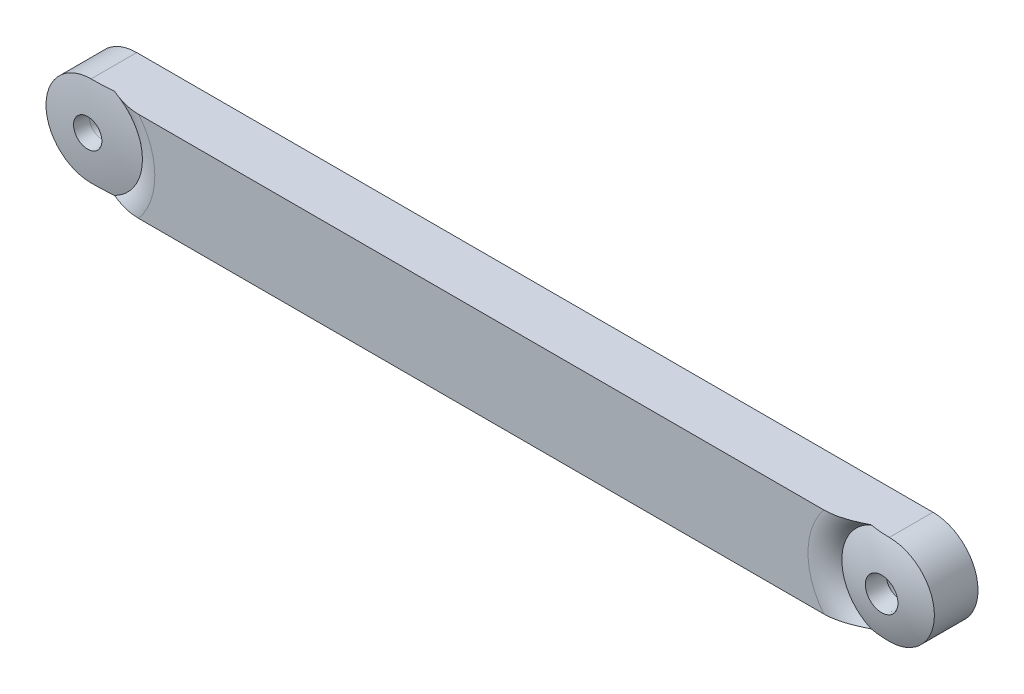
ISO-10303-21;
HEADER;
FILE_DESCRIPTION(('STEP AP214'),'2;1');
FILE_NAME('part.step','',(''),(''),'','','');
FILE_SCHEMA(('AUTOMOTIVE_DESIGN { 1 0 10303 214 1 1 1 1 }'));
ENDSEC;
DATA;
#1=APPLICATION_CONTEXT('core data for automotive mechanical design processes');
#2=APPLICATION_PROTOCOL_DEFINITION('international standard','automotive_design',2000,#1);
#3=PRODUCT_CONTEXT('',#1,'mechanical');
#4=PRODUCT('Part','Part','',(#3));
#5=PRODUCT_RELATED_PRODUCT_CATEGORY('part','',(#4));
#6=PRODUCT_DEFINITION_FORMATION('','',#4);
#7=PRODUCT_DEFINITION_CONTEXT('part definition',#1,'design');
#8=PRODUCT_DEFINITION('design','',#6,#7);
#9=PRODUCT_DEFINITION_SHAPE('','',#8);
#10=(LENGTH_UNIT() NAMED_UNIT(*) SI_UNIT(.MILLI.,.METRE.));
#11=(NAMED_UNIT(*) PLANE_ANGLE_UNIT() SI_UNIT($,.RADIAN.));
#12=(NAMED_UNIT(*) SI_UNIT($,.STERADIAN.) SOLID_ANGLE_UNIT());
#13=UNCERTAINTY_MEASURE_WITH_UNIT(LENGTH_MEASURE(1.E-05),#10,'distance_accuracy_value','');
#14=(GEOMETRIC_REPRESENTATION_CONTEXT(3) GLOBAL_UNCERTAINTY_ASSIGNED_CONTEXT((#13)) GLOBAL_UNIT_ASSIGNED_CONTEXT((#10,
#11,#12)) REPRESENTATION_CONTEXT('',''));
#15=CARTESIAN_POINT('',(0.,0.,0.));
#16=DIRECTION('',(0.,0.,1.));
#17=DIRECTION('',(1.,0.,0.));
#18=AXIS2_PLACEMENT_3D('',#15,#16,#17);
#19=CARTESIAN_POINT('',(18.5,89.493831222226,7.));
#20=DIRECTION('',(0.,1.,0.));
#21=DIRECTION('',(0.,0.,1.));
#22=AXIS2_PLACEMENT_3D('',#19,#20,#21);
#23=PLANE('',#22);
#24=CARTESIAN_POINT('',(124.5,89.493831222226,-8.97302143660501));
#25=DIRECTION('',(0.,1.,0.));
#26=DIRECTION('',(0.,0.,1.));
#27=AXIS2_PLACEMENT_3D('',#24,#25,#26);
#28=CIRCLE('',#27,14.7790451878915);
#29=CARTESIAN_POINT('',(124.5,89.493831222226,5.80602375128649));
#30=VERTEX_POINT('',#29);
#31=CARTESIAN_POINT('',(121.841743549819,89.493831222226,5.56499250309148));
#32=VERTEX_POINT('',#31);
#33=EDGE_CURVE('E119',#30,#32,#28,.F.);
#34=ORIENTED_EDGE('',*,*,#33,.T.);
#35=CARTESIAN_POINT('',(121.841743549819,89.493831222226,5.56499250309148));
#36=CARTESIAN_POINT('',(121.765317920901,89.493831222226,5.60204342012413));
#37=CARTESIAN_POINT('',(121.688876041818,89.493831222226,5.63906136675053));
#38=CARTESIAN_POINT('',(121.535841858416,89.493831222226,5.7127945517908));
#39=CARTESIAN_POINT('',(121.459249546677,89.493831222226,5.74950977478596));
#40=CARTESIAN_POINT('',(121.228991767959,89.493831222226,5.85888322927997));
#41=CARTESIAN_POINT('',(121.074934736782,89.493831222226,5.93072527463705));
#42=CARTESIAN_POINT('',(120.763998675751,89.493831222226,6.07116072767521));
#43=CARTESIAN_POINT('',(120.607107322743,89.493831222226,6.13972708391815));
#44=CARTESIAN_POINT('',(120.291178799112,89.493831222226,6.27165703233452));
#45=CARTESIAN_POINT('',(120.132142097978,89.493831222226,6.33502174200288));
#46=CARTESIAN_POINT('',(119.816106700858,89.493831222226,6.4536111009045));
#47=CARTESIAN_POINT('',(119.659175685572,89.493831222226,6.50901403404406));
#48=CARTESIAN_POINT('',(119.342952300375,89.493831222226,6.61260636058026));
#49=CARTESIAN_POINT('',(119.183659586522,89.493831222226,6.66079469172305));
#50=CARTESIAN_POINT('',(118.703242771847,89.493831222226,6.79261191880632));
#51=CARTESIAN_POINT('',(118.378468328636,89.493831222226,6.86392589629964));
#52=CARTESIAN_POINT('',(117.961259568196,89.493831222226,6.92816639643227));
#53=CARTESIAN_POINT('',(117.871605331821,89.493831222226,6.94038501670056));
#54=CARTESIAN_POINT('',(117.691885483508,89.493831222226,6.96156572368667));
#55=CARTESIAN_POINT('',(117.60181979638,89.493831222226,6.97052718892575));
#56=CARTESIAN_POINT('',(117.420748036511,89.493831222226,6.98507127344322));
#57=CARTESIAN_POINT('',(117.329739921034,89.493831222226,6.99062854189178));
#58=CARTESIAN_POINT('',(117.147581440085,89.493831222226,6.99809306103417));
#59=CARTESIAN_POINT('',(117.056431084771,89.493831222226,7.00000056141239));
#60=CARTESIAN_POINT('',(116.965272567196,89.493831222226,7.));
#61=B_SPLINE_CURVE_WITH_KNOTS('',3,(#35,#36,#37,#38,#39,#40,#41,#42,#43,#44,#45,#46,#47,#48,#49,
#50,#51,#52,#53,#54,#55,#56,#57,#58,#59,#60),.UNSPECIFIED.,.F.,.F.,(4,2,2,2,2,2,2,2,2,2,2,2,4),
(0.,0.254799675225444,0.509612249056838,1.0195359417198,1.53312357744277,2.04660058630545,
2.54569574884536,3.04486432437009,4.03963558253979,4.31104793084022,4.58251203859394,
4.85597389674887,5.12941704642665),.UNSPECIFIED.);
#62=CARTESIAN_POINT('',(116.965272567196,89.493831222226,7.));
#63=VERTEX_POINT('',#62);
#64=EDGE_CURVE('E122',#32,#63,#61,.T.);
#65=ORIENTED_EDGE('',*,*,#64,.T.);
#66=DIRECTION('',(1.,0.,0.));
#67=VECTOR('',#66,1.);
#68=CARTESIAN_POINT('',(18.5,89.493831222226,7.));
#69=LINE('',#68,#67);
#70=CARTESIAN_POINT('',(25.747500542297,89.493831222226,7.));
#71=VERTEX_POINT('',#70);
#72=EDGE_CURVE('E151',#71,#63,#69,.T.);
#73=ORIENTED_EDGE('',*,*,#72,.F.);
#74=CARTESIAN_POINT('',(25.747500542297,89.493831222226,7.));
#75=CARTESIAN_POINT('',(25.5169920155151,89.493831222226,7.00002588931948));
#76=CARTESIAN_POINT('',(25.2867684330342,89.493831222226,6.98818973963392));
#77=CARTESIAN_POINT('',(24.8288789761796,89.493831222226,6.94382752944468));
#78=CARTESIAN_POINT('',(24.6012080426734,89.493831222226,6.91135481729332));
#79=CARTESIAN_POINT('',(24.1515943162239,89.493831222226,6.82915886363204));
#80=CARTESIAN_POINT('',(23.929616433177,89.493831222226,6.77962120165669));
#81=CARTESIAN_POINT('',(23.4892788959588,89.493831222226,6.6661816275087));
#82=CARTESIAN_POINT('',(23.2709213362471,89.493831222226,6.60227169192598));
#83=CARTESIAN_POINT('',(22.9237555503254,89.493831222226,6.49080749413817));
#84=CARTESIAN_POINT('',(22.793775785392,89.493831222226,6.44681821387364));
#85=CARTESIAN_POINT('',(22.5350330104064,89.493831222226,6.35549810704841));
#86=CARTESIAN_POINT('',(22.4062696987997,89.493831222226,6.30816813466476));
#87=CARTESIAN_POINT('',(22.1488702397114,89.493831222226,6.21060945555799));
#88=CARTESIAN_POINT('',(22.0202407031539,89.493831222226,6.16036347797218));
#89=CARTESIAN_POINT('',(21.7636500830924,89.493831222226,6.05818092342479));
#90=CARTESIAN_POINT('',(21.635689010849,89.493831222226,6.00624431808986));
#91=CARTESIAN_POINT('',(21.5078993854901,89.493831222226,5.95392201712425));
#92=B_SPLINE_CURVE_WITH_KNOTS('',3,(#74,#75,#76,#77,#78,#79,#80,#81,#82,#83,#84,#85,#86,#87,#88,
#89,#90,#91),.UNSPECIFIED.,.F.,.F.,(4,2,2,2,2,2,2,2,4),(0.,0.69081013705975,1.37984165937013,
2.06160496880793,2.7437498257981,3.15537294830445,3.56689120207225,3.98116190171699,
4.39543955754246),.UNSPECIFIED.);
#93=CARTESIAN_POINT('',(21.5078993854901,89.493831222226,5.95392201712427));
#94=VERTEX_POINT('',#93);
#95=EDGE_CURVE('E183',#71,#94,#92,.T.);
#96=ORIENTED_EDGE('',*,*,#95,.T.);
#97=CARTESIAN_POINT('',(18.5,89.493831222226,-30.0113724473254));
#98=DIRECTION('',(0.,1.,0.));
#99=DIRECTION('',(0.,0.,1.));
#100=AXIS2_PLACEMENT_3D('',#97,#98,#99);
#101=CIRCLE('',#100,36.0908556926516);
#102=CARTESIAN_POINT('',(18.5,89.493831222226,6.07948324532625));
#103=VERTEX_POINT('',#102);
#104=EDGE_CURVE('E146',#103,#94,#101,.T.);
#105=ORIENTED_EDGE('',*,*,#104,.F.);
#106=DIRECTION('',(0.,0.,-1.));
#107=VECTOR('',#106,1.);
#108=CARTESIAN_POINT('',(18.5,89.493831222226,7.));
#109=LINE('',#108,#107);
#110=CARTESIAN_POINT('',(18.5,89.493831222226,0.));
#111=VERTEX_POINT('',#110);
#112=EDGE_CURVE('E172',#103,#111,#109,.T.);
#113=ORIENTED_EDGE('',*,*,#112,.T.);
#114=DIRECTION('',(1.,0.,0.));
#115=VECTOR('',#114,1.);
#116=CARTESIAN_POINT('',(18.5,89.493831222226,0.));
#117=LINE('',#116,#115);
#118=CARTESIAN_POINT('',(124.5,89.493831222226,0.));
#119=VERTEX_POINT('',#118);
#120=EDGE_CURVE('E159',#111,#119,#117,.T.);
#121=ORIENTED_EDGE('',*,*,#120,.T.);
#122=DIRECTION('',(0.,0.,-1.));
#123=VECTOR('',#122,1.);
#124=CARTESIAN_POINT('',(124.5,89.493831222226,7.));
#125=LINE('',#124,#123);
#126=EDGE_CURVE('E170',#30,#119,#125,.T.);
#127=ORIENTED_EDGE('',*,*,#126,.F.);
#128=EDGE_LOOP('',(#34,#65,#73,#96,#105,#113,#121,#127));
#129=FACE_BOUND('',#128,.T.);
#130=ADVANCED_FACE('F35',(#129),#23,.F.);
#131=CARTESIAN_POINT('',(18.5,101.493831222226,7.));
#132=DIRECTION('',(0.,-1.,0.));
#133=DIRECTION('',(1.,0.,0.));
#134=AXIS2_PLACEMENT_3D('',#131,#132,#133);
#135=PLANE('',#134);
#136=DIRECTION('',(-1.,0.,0.));
#137=VECTOR('',#136,1.);
#138=CARTESIAN_POINT('',(18.5,101.493831222226,7.));
#139=LINE('',#138,#137);
#140=CARTESIAN_POINT('',(116.965272567196,101.493831222226,7.));
#141=VERTEX_POINT('',#140);
#142=CARTESIAN_POINT('',(25.747500542297,101.493831222226,7.));
#143=VERTEX_POINT('',#142);
#144=EDGE_CURVE('E109',#141,#143,#139,.T.);
#145=ORIENTED_EDGE('',*,*,#144,.F.);
#146=CARTESIAN_POINT('',(116.965272567196,101.493831222226,7.));
#147=CARTESIAN_POINT('',(117.184672998858,101.493831222226,7.00001787596287));
#148=CARTESIAN_POINT('',(117.403844912924,101.493831222226,6.98896244737383));
#149=CARTESIAN_POINT('',(117.839875358581,101.493831222226,6.94716197226956));
#150=CARTESIAN_POINT('',(118.056737765339,101.493831222226,6.91645809091732));
#151=CARTESIAN_POINT('',(118.484402536377,101.493831222226,6.83831254298038));
#152=CARTESIAN_POINT('',(118.695247069074,101.493831222226,6.79109530042298));
#153=CARTESIAN_POINT('',(119.113181162417,101.493831222226,6.68220642957654));
#154=CARTESIAN_POINT('',(119.320269798328,101.493831222226,6.62053129230834));
#155=CARTESIAN_POINT('',(119.723481231176,101.493831222226,6.48740957795611));
#156=CARTESIAN_POINT('',(119.919738083752,101.493831222226,6.41636375120915));
#157=CARTESIAN_POINT('',(120.308730469959,101.493831222226,6.26520762910714));
#158=CARTESIAN_POINT('',(120.501465468203,101.493831222226,6.18509596867409));
#159=CARTESIAN_POINT('',(120.789642635796,101.493831222226,6.05936424705059));
#160=CARTESIAN_POINT('',(120.886182926368,101.493831222226,6.01622201449506));
#161=CARTESIAN_POINT('',(121.07864142418,101.493831222226,5.92856676950205));
#162=CARTESIAN_POINT('',(121.174559623077,101.493831222226,5.88405373872769));
#163=CARTESIAN_POINT('',(121.365832451622,101.493831222226,5.79407005305124));
#164=CARTESIAN_POINT('',(121.461187527706,101.493831222226,5.74860034154747));
#165=CARTESIAN_POINT('',(121.651620380279,101.493831222226,5.65710491264787));
#166=CARTESIAN_POINT('',(121.746698181258,101.493831222226,5.6110792463244));
#167=CARTESIAN_POINT('',(121.841743549819,101.493831222226,5.56499250309151));
#168=B_SPLINE_CURVE_WITH_KNOTS('',3,(#146,#147,#148,#149,#150,#151,#152,#153,#154,#155,#156,
#157,#158,#159,#160,#161,#162,#163,#164,#165,#166,#167),.UNSPECIFIED.,.F.,.F.,(4,2,2,2,2,2,2,2,
2,2,4),(0.,0.657592536034672,1.31381185085826,1.96143880953814,2.60922311246948,
3.23511158444727,3.86109442460975,4.17831125031737,4.49553232121324,4.81245401643313,
5.12934681602724),.UNSPECIFIED.);
#169=CARTESIAN_POINT('',(121.841743549819,101.493831222226,5.56499250309148));
#170=VERTEX_POINT('',#169);
#171=EDGE_CURVE('E11',#141,#170,#168,.T.);
#172=ORIENTED_EDGE('',*,*,#171,.T.);
#173=CARTESIAN_POINT('',(124.5,101.493831222226,-8.97302143660501));
#174=DIRECTION('',(0.,-1.,0.));
#175=DIRECTION('',(1.,0.,0.));
#176=AXIS2_PLACEMENT_3D('',#173,#174,#175);
#177=CIRCLE('',#176,14.7790451878915);
#178=CARTESIAN_POINT('',(124.5,101.493831222226,5.80602375128649));
#179=VERTEX_POINT('',#178);
#180=EDGE_CURVE('E107',#170,#179,#177,.F.);
#181=ORIENTED_EDGE('',*,*,#180,.T.);
#182=DIRECTION('',(0.,0.,-1.));
#183=VECTOR('',#182,1.);
#184=CARTESIAN_POINT('',(124.5,101.493831222226,7.));
#185=LINE('',#184,#183);
#186=CARTESIAN_POINT('',(124.5,101.493831222226,0.));
#187=VERTEX_POINT('',#186);
#188=EDGE_CURVE('E168',#179,#187,#185,.T.);
#189=ORIENTED_EDGE('',*,*,#188,.T.);
#190=DIRECTION('',(-1.,0.,0.));
#191=VECTOR('',#190,1.);
#192=CARTESIAN_POINT('',(18.5,101.493831222226,0.));
#193=LINE('',#192,#191);
#194=CARTESIAN_POINT('',(18.5,101.493831222226,0.));
#195=VERTEX_POINT('',#194);
#196=EDGE_CURVE('E153',#187,#195,#193,.T.);
#197=ORIENTED_EDGE('',*,*,#196,.T.);
#198=DIRECTION('',(0.,0.,-1.));
#199=VECTOR('',#198,1.);
#200=CARTESIAN_POINT('',(18.5,101.493831222226,7.));
#201=LINE('',#200,#199);
#202=CARTESIAN_POINT('',(18.5,101.493831222226,6.07948324532625));
#203=VERTEX_POINT('',#202);
#204=EDGE_CURVE('E155',#203,#195,#201,.T.);
#205=ORIENTED_EDGE('',*,*,#204,.F.);
#206=CARTESIAN_POINT('',(18.5,101.493831222226,-30.0113724473254));
#207=DIRECTION('',(0.,-1.,0.));
#208=DIRECTION('',(1.,0.,0.));
#209=AXIS2_PLACEMENT_3D('',#206,#207,#208);
#210=CIRCLE('',#209,36.0908556926516);
#211=CARTESIAN_POINT('',(21.5078993854902,101.493831222226,5.95392201712427));
#212=VERTEX_POINT('',#211);
#213=EDGE_CURVE('E174',#212,#203,#210,.T.);
#214=ORIENTED_EDGE('',*,*,#213,.F.);
#215=CARTESIAN_POINT('',(21.5078993854902,101.493831222226,5.95392201712427));
#216=CARTESIAN_POINT('',(21.5926536728955,101.493831222226,5.98860839873557));
#217=CARTESIAN_POINT('',(21.6774730391797,101.493831222226,6.02313741677694));
#218=CARTESIAN_POINT('',(21.8473595161257,101.493831222226,6.09159688736667));
#219=CARTESIAN_POINT('',(21.9324266437582,101.493831222226,6.12552729773314));
#220=CARTESIAN_POINT('',(22.1882767086164,101.493831222226,6.22603404367458));
#221=CARTESIAN_POINT('',(22.3595908262225,101.493831222226,6.29127688167225));
#222=CARTESIAN_POINT('',(22.7025238441883,101.493831222226,6.41560894361206));
#223=CARTESIAN_POINT('',(22.8741226209567,101.493831222226,6.47475310702858));
#224=CARTESIAN_POINT('',(23.2196117271588,101.493831222226,6.58591140083442));
#225=CARTESIAN_POINT('',(23.393501745622,101.493831222226,6.63792648808529));
#226=CARTESIAN_POINT('',(23.7452251123599,101.493831222226,6.73366009728708));
#227=CARTESIAN_POINT('',(23.9230797082013,101.493831222226,6.77730145263285));
#228=CARTESIAN_POINT('',(24.2810258359925,101.493831222226,6.85413347819978));
#229=CARTESIAN_POINT('',(24.46111699277,101.493831222226,6.88732587721382));
#230=CARTESIAN_POINT('',(24.824899065325,101.493831222226,6.94199792849482));
#231=CARTESIAN_POINT('',(25.0086079523525,101.493831222226,6.96336102994884));
#232=CARTESIAN_POINT('',(25.3773368336589,101.493831222226,6.99237728423305));
#233=CARTESIAN_POINT('',(25.5623582631819,101.493831222226,7.00001188870514));
#234=CARTESIAN_POINT('',(25.747500542297,101.493831222226,7.));
#235=B_SPLINE_CURVE_WITH_KNOTS('',3,(#215,#216,#217,#218,#219,#220,#221,#222,#223,#224,#225,
#226,#227,#228,#229,#230,#231,#232,#233,#234),.UNSPECIFIED.,.F.,.F.,(4,2,2,2,2,2,2,2,2,4),(0.,
0.274732558079257,0.549484398940114,1.09936997138419,1.6437648951629,2.18808667878282,
2.73720610299631,3.28623462690635,3.84058046715998,4.39567471428942),.UNSPECIFIED.);
#236=EDGE_CURVE('E49',#212,#143,#235,.T.);
#237=ORIENTED_EDGE('',*,*,#236,.T.);
#238=EDGE_LOOP('',(#145,#172,#181,#189,#197,#205,#214,#237));
#239=FACE_BOUND('',#238,.T.);
#240=ADVANCED_FACE('F106',(#239),#135,.F.);
#241=CARTESIAN_POINT('',(18.5,95.493831222226,7.));
#242=DIRECTION('',(0.,0.,-1.));
#243=DIRECTION('',(-1.,0.,0.));
#244=AXIS2_PLACEMENT_3D('',#241,#242,#243);
#245=CYLINDRICAL_SURFACE('',#244,5.99999999999999);
#246=CARTESIAN_POINT('',(18.5,95.493831222226,6.07948324532625));
#247=DIRECTION('',(0.,0.,-1.));
#248=DIRECTION('',(-1.,0.,0.));
#249=AXIS2_PLACEMENT_3D('',#246,#247,#248);
#250=CIRCLE('',#249,5.99999999999999);
#251=EDGE_CURVE('E144',#203,#103,#250,.F.);
#252=ORIENTED_EDGE('',*,*,#251,.F.);
#253=ORIENTED_EDGE('',*,*,#204,.T.);
#254=CARTESIAN_POINT('',(18.5,95.493831222226,0.));
#255=DIRECTION('',(0.,0.,1.));
#256=DIRECTION('',(1.,0.,0.));
#257=AXIS2_PLACEMENT_3D('',#254,#255,#256);
#258=CIRCLE('',#257,5.99999999999999);
#259=EDGE_CURVE('E156',#195,#111,#258,.T.);
#260=ORIENTED_EDGE('',*,*,#259,.T.);
#261=ORIENTED_EDGE('',*,*,#112,.F.);
#262=EDGE_LOOP('',(#252,#253,#260,#261));
#263=FACE_BOUND('',#262,.T.);
#264=ADVANCED_FACE('F203',(#263),#245,.T.);
#265=CARTESIAN_POINT('',(18.5,95.493831222226,7.));
#266=DIRECTION('',(0.,0.,1.));
#267=DIRECTION('',(1.,0.,0.));
#268=AXIS2_PLACEMENT_3D('',#265,#266,#267);
#269=PLANE('',#268);
#270=ORIENTED_EDGE('',*,*,#72,.T.);
#271=CARTESIAN_POINT('',(124.5,95.493831222226,7.));
#272=DIRECTION('',(0.,0.,1.));
#273=DIRECTION('',(1.,0.,0.));
#274=AXIS2_PLACEMENT_3D('',#271,#272,#273);
#275=CIRCLE('',#274,9.63182835637385);
#276=EDGE_CURVE('E62',#63,#141,#275,.F.);
#277=ORIENTED_EDGE('',*,*,#276,.T.);
#278=ORIENTED_EDGE('',*,*,#144,.T.);
#279=CARTESIAN_POINT('',(18.5,95.493831222226,7.));
#280=DIRECTION('',(0.,0.,1.));
#281=DIRECTION('',(1.,0.,0.));
#282=AXIS2_PLACEMENT_3D('',#279,#280,#281);
#283=CIRCLE('',#282,9.40883967929071);
#284=EDGE_CURVE('E274',#143,#71,#283,.F.);
#285=ORIENTED_EDGE('',*,*,#284,.T.);
#286=EDGE_LOOP('',(#270,#277,#278,#285));
#287=FACE_BOUND('',#286,.T.);
#288=ADVANCED_FACE('F206',(#287),#269,.T.);
#289=CARTESIAN_POINT('',(18.5,95.493831222226,0.));
#290=DIRECTION('',(0.,0.,1.));
#291=DIRECTION('',(1.,0.,0.));
#292=AXIS2_PLACEMENT_3D('',#289,#290,#291);
#293=PLANE('',#292);
#294=CARTESIAN_POINT('',(124.5,95.493831222226,0.));
#295=DIRECTION('',(0.,0.,1.));
#296=DIRECTION('',(1.,0.,0.));
#297=AXIS2_PLACEMENT_3D('',#294,#295,#296);
#298=CIRCLE('',#297,3.96601629417615);
#299=CARTESIAN_POINT('',(128.466016294176,95.493831222226,0.));
#300=VERTEX_POINT('',#299);
#301=EDGE_CURVE('E131',#300,#300,#298,.T.);
#302=ORIENTED_EDGE('',*,*,#301,.T.);
#303=EDGE_LOOP('',(#302));
#304=FACE_BOUND('',#303,.T.);
#305=CARTESIAN_POINT('',(18.5,95.493831222226,0.));
#306=DIRECTION('',(0.,0.,1.));
#307=DIRECTION('',(1.,0.,0.));
#308=AXIS2_PLACEMENT_3D('',#305,#306,#307);
#309=CIRCLE('',#308,3.48242734780151);
#310=CARTESIAN_POINT('',(21.9824273478015,95.493831222226,0.));
#311=VERTEX_POINT('',#310);
#312=EDGE_CURVE('E150',#311,#311,#309,.F.);
#313=ORIENTED_EDGE('',*,*,#312,.F.);
#314=EDGE_LOOP('',(#313));
#315=FACE_BOUND('',#314,.T.);
#316=ORIENTED_EDGE('',*,*,#259,.F.);
#317=ORIENTED_EDGE('',*,*,#196,.F.);
#318=CARTESIAN_POINT('',(124.5,95.493831222226,0.));
#319=DIRECTION('',(0.,0.,1.));
#320=DIRECTION('',(1.,0.,0.));
#321=AXIS2_PLACEMENT_3D('',#318,#319,#320);
#322=CIRCLE('',#321,6.00000000000001);
#323=EDGE_CURVE('E162',#119,#187,#322,.T.);
#324=ORIENTED_EDGE('',*,*,#323,.F.);
#325=ORIENTED_EDGE('',*,*,#120,.F.);
#326=EDGE_LOOP('',(#316,#317,#324,#325));
#327=FACE_BOUND('',#326,.T.);
#328=ADVANCED_FACE('F263',(#304,#315,#327),#293,.F.);
#329=CARTESIAN_POINT('',(124.5,95.493831222226,7.));
#330=DIRECTION('',(0.,0.,-1.));
#331=DIRECTION('',(-1.,0.,0.));
#332=AXIS2_PLACEMENT_3D('',#329,#330,#331);
#333=CYLINDRICAL_SURFACE('',#332,6.00000000000001);
#334=ORIENTED_EDGE('',*,*,#188,.F.);
#335=CARTESIAN_POINT('',(124.5,95.493831222226,5.80602375128649));
#336=DIRECTION('',(0.,0.,-1.));
#337=DIRECTION('',(-1.,0.,0.));
#338=AXIS2_PLACEMENT_3D('',#335,#336,#337);
#339=CIRCLE('',#338,6.00000000000001);
#340=EDGE_CURVE('E118',#179,#30,#339,.T.);
#341=ORIENTED_EDGE('',*,*,#340,.T.);
#342=ORIENTED_EDGE('',*,*,#126,.T.);
#343=ORIENTED_EDGE('',*,*,#323,.T.);
#344=EDGE_LOOP('',(#334,#341,#342,#343));
#345=FACE_BOUND('',#344,.T.);
#346=ADVANCED_FACE('F202',(#345),#333,.T.);
#347=CARTESIAN_POINT('',(18.5,95.493831222226,-0.188328384760994));
#348=DIRECTION('',(0.,0.,-1.));
#349=DIRECTION('',(-1.,0.,0.));
#350=AXIS2_PLACEMENT_3D('',#347,#348,#349);
#351=CONICAL_SURFACE('',#350,3.5,0.0930391787987164);
#352=CARTESIAN_POINT('',(18.5,95.493831222226,0.893662385724943));
#353=DIRECTION('',(0.,0.,1.));
#354=DIRECTION('',(1.,0.,0.));
#355=AXIS2_PLACEMENT_3D('',#352,#353,#354);
#356=CIRCLE('',#355,3.39904098887773);
#357=CARTESIAN_POINT('',(15.1009590111223,95.493831222226,0.893662385724948));
#358=VERTEX_POINT('',#357);
#359=EDGE_CURVE('E140',#358,#358,#356,.T.);
#360=ORIENTED_EDGE('',*,*,#359,.T.);
#361=EDGE_LOOP('',(#360));
#362=FACE_BOUND('',#361,.T.);
#363=ORIENTED_EDGE('',*,*,#312,.T.);
#364=EDGE_LOOP('',(#363));
#365=FACE_BOUND('',#364,.T.);
#366=ADVANCED_FACE('F251',(#362,#365),#351,.F.);
#367=CARTESIAN_POINT('',(18.5,95.493831222226,37.3216239672317));
#368=DIRECTION('',(0.,0.,1.));
#369=DIRECTION('',(-1.,0.,0.));
#370=AXIS2_PLACEMENT_3D('',#367,#368,#369);
#371=SPHERICAL_SURFACE('',#370,36.5861977339516);
#372=CARTESIAN_POINT('',(18.5,95.493831222226,0.783957184651782));
#373=DIRECTION('',(0.,0.,1.));
#374=DIRECTION('',(1.,0.,0.));
#375=AXIS2_PLACEMENT_3D('',#372,#373,#374);
#376=CIRCLE('',#375,1.88381812098707);
#377=CARTESIAN_POINT('',(16.6161818790131,95.493831222226,0.783957184651775));
#378=VERTEX_POINT('',#377);
#379=EDGE_CURVE('E132',#378,#378,#376,.T.);
#380=CARTESIAN_POINT('',(16.6161818790131,95.493831222226,0.783957184651775));
#381=CARTESIAN_POINT('',(16.6003768482195,95.493831222226,0.784772064358287));
#382=CARTESIAN_POINT('',(16.5845723461631,95.493831222226,0.785597199206291));
#383=CARTESIAN_POINT('',(16.5529644261386,95.493831222226,0.787267977768484));
#384=CARTESIAN_POINT('',(16.5371610081704,95.493831222226,0.788113621482674));
#385=CARTESIAN_POINT('',(16.5055552829362,95.493831222226,0.789825416360444));
#386=CARTESIAN_POINT('',(16.4897529756702,95.493831222226,0.790691567524025));
#387=CARTESIAN_POINT('',(16.4581494984518,95.493831222226,0.792444375839986));
#388=CARTESIAN_POINT('',(16.4423483284995,95.493831222226,0.793331032992367));
#389=CARTESIAN_POINT('',(16.4107471525183,95.493831222226,0.795124851793297));
#390=CARTESIAN_POINT('',(16.3949471464895,95.493831222226,0.796032013441845));
#391=CARTESIAN_POINT('',(16.3633483249631,95.493831222226,0.797866839707272));
#392=CARTESIAN_POINT('',(16.3475495094655,95.493831222226,0.79879450432415));
#393=CARTESIAN_POINT('',(16.3159530956073,95.493831222226,0.800670334964053));
#394=CARTESIAN_POINT('',(16.3001554972468,95.493831222226,0.801618500987079));
#395=CARTESIAN_POINT('',(16.2685615442665,95.493831222226,0.803535332842521));
#396=CARTESIAN_POINT('',(16.2527651896468,95.493831222226,0.804503998674937));
#397=CARTESIAN_POINT('',(16.2211737507497,95.493831222226,0.806461828517897));
#398=CARTESIAN_POINT('',(16.2053786664723,95.493831222226,0.807450992528441));
#399=CARTESIAN_POINT('',(16.1737897948596,95.493831222226,0.809449817061862));
#400=CARTESIAN_POINT('',(16.1579960075241,95.493831222226,0.810459477584739));
#401=CARTESIAN_POINT('',(16.1264097563925,95.493831222226,0.812499293442525));
#402=CARTESIAN_POINT('',(16.1106172925963,95.493831222226,0.813529448777433));
#403=CARTESIAN_POINT('',(16.0790337151382,95.493831222226,0.81561025252446));
#404=CARTESIAN_POINT('',(16.0632426014764,95.493831222226,0.816660900936579));
#405=CARTESIAN_POINT('',(16.0316617508798,95.493831222226,0.818782689068702));
#406=CARTESIAN_POINT('',(16.015872013945,95.493831222226,0.819853828788706));
#407=CARTESIAN_POINT('',(15.9842939433932,95.493831222226,0.822016597732754));
#408=CARTESIAN_POINT('',(15.968505609776,95.493831222226,0.823108226956798));
#409=CARTESIAN_POINT('',(15.9369303724476,95.493831222226,0.825311973070583));
#410=CARTESIAN_POINT('',(15.9211434687362,95.493831222226,0.826424089960325));
#411=CARTESIAN_POINT('',(15.889571117805,95.493831222226,0.828668809532666));
#412=CARTESIAN_POINT('',(15.8737856705851,95.493831222226,0.829801412215265));
#413=CARTESIAN_POINT('',(15.8422162592201,95.493831222226,0.832087101465972));
#414=CARTESIAN_POINT('',(15.826432295075,95.493831222226,0.833240188034079));
#415=CARTESIAN_POINT('',(15.7948658764403,95.493831222226,0.835566843113958));
#416=CARTESIAN_POINT('',(15.7790834219507,95.493831222226,0.83674041162573));
#417=CARTESIAN_POINT('',(15.7475200492052,95.493831222226,0.83910802861662));
#418=CARTESIAN_POINT('',(15.7317391309494,95.493831222226,0.840302077095737));
#419=CARTESIAN_POINT('',(15.7001788572471,95.493831222226,0.84271065201048));
#420=CARTESIAN_POINT('',(15.6843995018006,95.493831222226,0.843925178446106));
#421=CARTESIAN_POINT('',(15.6528423802902,95.493831222226,0.846374707228573));
#422=CARTESIAN_POINT('',(15.6370646142261,95.493831222226,0.847609709575414));
#423=CARTESIAN_POINT('',(15.6055106980508,95.493831222226,0.850100188100512));
#424=CARTESIAN_POINT('',(15.5897345479395,95.493831222226,0.851355664278769));
#425=CARTESIAN_POINT('',(15.5581838902373,95.493831222226,0.853887088352434));
#426=CARTESIAN_POINT('',(15.5424093826464,95.493831222226,0.855163036247842));
#427=CARTESIAN_POINT('',(15.5108620365497,95.493831222226,0.857735401607068));
#428=CARTESIAN_POINT('',(15.495089198044,95.493831222226,0.859031819070887));
#429=CARTESIAN_POINT('',(15.4635452166798,95.493831222226,0.861645121383721));
#430=CARTESIAN_POINT('',(15.4477740738213,95.493831222226,0.862962006232737));
#431=CARTESIAN_POINT('',(15.4162335103108,95.493831222226,0.865616241098275));
#432=CARTESIAN_POINT('',(15.4004640896587,95.493831222226,0.866953591114797));
#433=CARTESIAN_POINT('',(15.3689269971173,95.493831222226,0.869648754063218));
#434=CARTESIAN_POINT('',(15.353159325228,95.493831222226,0.871006566995118));
#435=CARTESIAN_POINT('',(15.3216257567653,95.493831222226,0.873742653487643));
#436=CARTESIAN_POINT('',(15.305859860192,95.493831222226,0.875120927048269));
#437=CARTESIAN_POINT('',(15.2743298689118,95.493831222226,0.87789793247733));
#438=CARTESIAN_POINT('',(15.2585657742049,95.493831222226,0.879296664345765));
#439=CARTESIAN_POINT('',(15.2270394132048,95.493831222226,0.882114584034403));
#440=CARTESIAN_POINT('',(15.2112771469115,95.493831222226,0.883533771854606));
#441=CARTESIAN_POINT('',(15.1797544692831,95.493831222226,0.886392601058766));
#442=CARTESIAN_POINT('',(15.1639940579479,95.493831222226,0.887832242442724));
#443=CARTESIAN_POINT('',(15.1324751167761,95.493831222226,0.890731976342707));
#444=CARTESIAN_POINT('',(15.1167165869395,95.493831222226,0.892192068858732));
#445=CARTESIAN_POINT('',(15.1009590111223,95.493831222226,0.893662385724948));
#446=B_SPLINE_CURVE_WITH_KNOTS('',3,(#380,#381,#382,#383,#384,#385,#386,#387,#388,#389,#390,
#391,#392,#393,#394,#395,#396,#397,#398,#399,#400,#401,#402,#403,#404,#405,#406,#407,#408,#409,
#410,#411,#412,#413,#414,#415,#416,#417,#418,#419,#420,#421,#422,#423,#424,#425,#426,#427,#428,
#429,#430,#431,#432,#433,#434,#435,#436,#437,#438,#439,#440,#441,#442,#443,#444,#445),
.UNSPECIFIED.,.F.,.F.,(4,2,2,2,2,2,2,2,2,2,2,2,2,2,2,2,2,2,2,2,2,2,2,2,2,2,2,2,2,2,2,2,4),(0.,
0.0474780678792438,0.094956135758484,0.142434203637728,0.189912271516968,0.23739033939621,
0.284868407275454,0.332346475154692,0.379824543033935,0.427302610913169,0.47478067879241,
0.522258746671651,0.569736814550894,0.617214882430136,0.664692950309379,0.71217101818862,
0.759649086067861,0.807127153947105,0.854605221826347,0.902083289705588,0.94956135758483,
0.997039425464072,1.04451749334331,1.09199556122255,1.13947362910179,1.18695169698103,
1.23442976486027,1.28190783273952,1.32938590061876,1.376863968498,1.42434203637724,
1.47182010425648,1.51929817213572),.UNSPECIFIED.);
#447=EDGE_CURVE('BSEAM241',#378,#358,#446,.T.);
#448=ORIENTED_EDGE('',*,*,#379,.T.);
#449=ORIENTED_EDGE('',*,*,#359,.F.);
#450=ORIENTED_EDGE('',*,*,#447,.T.);
#451=ORIENTED_EDGE('',*,*,#447,.F.);
#452=EDGE_LOOP('',(#448,#450,#449,#451));
#453=FACE_BOUND('',#452,.T.);
#454=ADVANCED_FACE('F241',(#453),#371,.T.);
#455=CARTESIAN_POINT('',(18.5,95.493831222226,0.783957184651782));
#456=DIRECTION('',(0.,0.,-1.));
#457=DIRECTION('',(-1.,0.,0.));
#458=AXIS2_PLACEMENT_3D('',#455,#456,#457);
#459=CONICAL_SURFACE('',#458,1.88381812098707,0.184494936959158);
#460=CARTESIAN_POINT('',(18.5,95.493831222226,2.57274315785992));
#461=DIRECTION('',(0.,0.,-1.));
#462=DIRECTION('',(-1.,0.,0.));
#463=AXIS2_PLACEMENT_3D('',#460,#461,#462);
#464=CIRCLE('',#463,1.54999999999999);
#465=CARTESIAN_POINT('',(16.95,95.493831222226,2.57274315785992));
#466=VERTEX_POINT('',#465);
#467=EDGE_CURVE('E143',#466,#466,#464,.T.);
#468=ORIENTED_EDGE('',*,*,#467,.F.);
#469=EDGE_LOOP('',(#468));
#470=FACE_BOUND('',#469,.T.);
#471=ORIENTED_EDGE('',*,*,#379,.F.);
#472=EDGE_LOOP('',(#471));
#473=FACE_BOUND('',#472,.T.);
#474=ADVANCED_FACE('F237',(#470,#473),#459,.F.);
#475=CARTESIAN_POINT('',(18.5,95.493831222226,-30.0113724473254));
#476=DIRECTION('',(0.,0.,1.));
#477=DIRECTION('',(-1.,0.,0.));
#478=AXIS2_PLACEMENT_3D('',#475,#476,#477);
#479=SPHERICAL_SURFACE('',#478,36.5861977339516);
#480=CARTESIAN_POINT('',(18.5,95.493831222226,6.52629433525455));
#481=DIRECTION('',(0.,0.,1.));
#482=DIRECTION('',(1.,0.,0.));
#483=AXIS2_PLACEMENT_3D('',#480,#481,#482);
#484=CIRCLE('',#483,1.88381812098707);
#485=CARTESIAN_POINT('',(20.3838181209871,95.493831222226,6.52629433525455));
#486=VERTEX_POINT('',#485);
#487=EDGE_CURVE('E135',#486,#486,#484,.T.);
#488=ORIENTED_EDGE('',*,*,#487,.F.);
#489=EDGE_LOOP('',(#488));
#490=FACE_BOUND('',#489,.T.);
#491=ORIENTED_EDGE('',*,*,#104,.T.);
#492=CARTESIAN_POINT('',(18.5,95.493831222226,5.95392201712427));
#493=DIRECTION('',(0.,0.,1.));
#494=DIRECTION('',(1.,0.,0.));
#495=AXIS2_PLACEMENT_3D('',#492,#493,#494);
#496=CIRCLE('',#495,6.71174036396164);
#497=EDGE_CURVE('E138',#94,#212,#496,.T.);
#498=ORIENTED_EDGE('',*,*,#497,.T.);
#499=ORIENTED_EDGE('',*,*,#213,.T.);
#500=ORIENTED_EDGE('',*,*,#251,.T.);
#501=EDGE_LOOP('',(#491,#498,#499,#500));
#502=FACE_BOUND('',#501,.T.);
#503=ADVANCED_FACE('F240',(#490,#502),#479,.T.);
#504=CARTESIAN_POINT('',(18.5,95.493831222226,3.65512575995318));
#505=DIRECTION('',(0.,0.,1.));
#506=DIRECTION('',(1.,0.,0.));
#507=AXIS2_PLACEMENT_3D('',#504,#505,#506);
#508=CONICAL_SURFACE('',#507,1.34800885526183,0.18449493695916);
#509=CARTESIAN_POINT('',(18.5,95.493831222226,4.73750836204643));
#510=DIRECTION('',(0.,0.,1.));
#511=DIRECTION('',(1.,0.,0.));
#512=AXIS2_PLACEMENT_3D('',#509,#510,#511);
#513=CIRCLE('',#512,1.54999999999999);
#514=CARTESIAN_POINT('',(20.05,95.493831222226,4.73750836204643));
#515=VERTEX_POINT('',#514);
#516=EDGE_CURVE('E147',#515,#515,#513,.T.);
#517=ORIENTED_EDGE('',*,*,#516,.F.);
#518=EDGE_LOOP('',(#517));
#519=FACE_BOUND('',#518,.T.);
#520=ORIENTED_EDGE('',*,*,#487,.T.);
#521=EDGE_LOOP('',(#520));
#522=FACE_BOUND('',#521,.T.);
#523=ADVANCED_FACE('F243',(#519,#522),#508,.F.);
#524=CARTESIAN_POINT('',(18.5,95.493831222226,7.));
#525=DIRECTION('',(0.,0.,-1.));
#526=DIRECTION('',(-1.,0.,0.));
#527=AXIS2_PLACEMENT_3D('',#524,#525,#526);
#528=CYLINDRICAL_SURFACE('',#527,1.54999999999999);
#529=ORIENTED_EDGE('',*,*,#467,.T.);
#530=EDGE_LOOP('',(#529));
#531=FACE_BOUND('',#530,.T.);
#532=ORIENTED_EDGE('',*,*,#516,.T.);
#533=EDGE_LOOP('',(#532));
#534=FACE_BOUND('',#533,.T.);
#535=ADVANCED_FACE('F246',(#531,#534),#528,.F.);
#536=CARTESIAN_POINT('',(124.5,95.493831222226,1.37679227965256));
#537=DIRECTION('',(0.,0.,-1.));
#538=DIRECTION('',(-1.,0.,0.));
#539=AXIS2_PLACEMENT_3D('',#536,#537,#538);
#540=CONICAL_SURFACE('',#539,3.76140287655917,0.14753616826198);
#541=CARTESIAN_POINT('',(124.5,95.493831222226,1.37679227965256));
#542=DIRECTION('',(0.,0.,1.));
#543=DIRECTION('',(1.,0.,0.));
#544=AXIS2_PLACEMENT_3D('',#541,#542,#543);
#545=CIRCLE('',#544,3.76140287655917);
#546=CARTESIAN_POINT('',(128.261402876559,95.493831222226,1.37679227965256));
#547=VERTEX_POINT('',#546);
#548=EDGE_CURVE('E406',#547,#547,#545,.T.);
#549=ORIENTED_EDGE('',*,*,#548,.T.);
#550=EDGE_LOOP('',(#549));
#551=FACE_BOUND('',#550,.T.);
#552=ORIENTED_EDGE('',*,*,#301,.F.);
#553=EDGE_LOOP('',(#552));
#554=FACE_BOUND('',#553,.T.);
#555=ADVANCED_FACE('F229',(#551,#554),#540,.F.);
#556=CARTESIAN_POINT('',(124.5,95.493831222226,-8.97302143660501));
#557=DIRECTION('',(0.,0.,1.));
#558=DIRECTION('',(1.,0.,0.));
#559=AXIS2_PLACEMENT_3D('',#556,#557,#558);
#560=SPHERICAL_SURFACE('',#559,15.9505541178273);
#561=CARTESIAN_POINT('',(124.5,95.493831222226,6.82951727592407));
#562=DIRECTION('',(0.,0.,1.));
#563=DIRECTION('',(1.,0.,0.));
#564=AXIS2_PLACEMENT_3D('',#561,#562,#563);
#565=CIRCLE('',#564,2.16793609332901);
#566=CARTESIAN_POINT('',(126.667936093329,95.493831222226,6.82951727592407));
#567=VERTEX_POINT('',#566);
#568=EDGE_CURVE('E123',#567,#567,#565,.T.);
#569=ORIENTED_EDGE('',*,*,#568,.F.);
#570=EDGE_LOOP('',(#569));
#571=FACE_BOUND('',#570,.T.);
#572=ORIENTED_EDGE('',*,*,#340,.F.);
#573=ORIENTED_EDGE('',*,*,#180,.F.);
#574=CARTESIAN_POINT('',(124.5,95.493831222226,5.56499250309148));
#575=DIRECTION('',(0.,0.,1.));
#576=DIRECTION('',(1.,0.,0.));
#577=AXIS2_PLACEMENT_3D('',#574,#575,#576);
#578=CIRCLE('',#577,6.56249398894425);
#579=EDGE_CURVE('E115',#170,#32,#578,.T.);
#580=ORIENTED_EDGE('',*,*,#579,.T.);
#581=ORIENTED_EDGE('',*,*,#33,.F.);
#582=EDGE_LOOP('',(#572,#573,#580,#581));
#583=FACE_BOUND('',#582,.T.);
#584=ADVANCED_FACE('F114',(#571,#583),#560,.T.);
#585=CARTESIAN_POINT('',(124.5,95.493831222226,6.82951727592407));
#586=DIRECTION('',(0.,0.,1.));
#587=DIRECTION('',(1.,0.,0.));
#588=AXIS2_PLACEMENT_3D('',#585,#586,#587);
#589=CONICAL_SURFACE('',#588,2.16793609332901,0.13265170138596);
#590=CARTESIAN_POINT('',(124.5,95.493831222226,4.3736489776463));
#591=DIRECTION('',(0.,0.,1.));
#592=DIRECTION('',(1.,0.,0.));
#593=AXIS2_PLACEMENT_3D('',#590,#591,#592);
#594=CIRCLE('',#593,1.84023660808576);
#595=CARTESIAN_POINT('',(126.340236608086,95.493831222226,4.3736489776463));
#596=VERTEX_POINT('',#595);
#597=EDGE_CURVE('E126',#596,#596,#594,.T.);
#598=ORIENTED_EDGE('',*,*,#597,.F.);
#599=EDGE_LOOP('',(#598));
#600=FACE_BOUND('',#599,.T.);
#601=ORIENTED_EDGE('',*,*,#568,.T.);
#602=EDGE_LOOP('',(#601));
#603=FACE_BOUND('',#602,.T.);
#604=ADVANCED_FACE('F223',(#600,#603),#589,.F.);
#605=CARTESIAN_POINT('',(124.5,95.493831222226,4.3736489776463));
#606=DIRECTION('',(0.,0.,-1.));
#607=DIRECTION('',(-1.,0.,0.));
#608=AXIS2_PLACEMENT_3D('',#605,#606,#607);
#609=CONICAL_SURFACE('',#608,1.84023660808576,0.147536168262031);
#610=CARTESIAN_POINT('',(124.5,95.493831222226,1.11149063364168));
#611=DIRECTION('',(0.,0.,1.));
#612=DIRECTION('',(1.,0.,0.));
#613=AXIS2_PLACEMENT_3D('',#610,#611,#612);
#614=CIRCLE('',#613,2.32504566566068);
#615=CARTESIAN_POINT('',(126.825045665661,95.493831222226,1.11149063364168));
#616=VERTEX_POINT('',#615);
#617=EDGE_CURVE('E411',#616,#616,#614,.T.);
#618=ORIENTED_EDGE('',*,*,#617,.F.);
#619=EDGE_LOOP('',(#618));
#620=FACE_BOUND('',#619,.T.);
#621=ORIENTED_EDGE('',*,*,#597,.T.);
#622=EDGE_LOOP('',(#621));
#623=FACE_BOUND('',#622,.T.);
#624=ADVANCED_FACE('F217',(#620,#623),#609,.F.);
#625=CARTESIAN_POINT('',(124.5,95.493831222226,17.7203193918976));
#626=DIRECTION('',(0.,0.,1.));
#627=DIRECTION('',(1.,0.,0.));
#628=AXIS2_PLACEMENT_3D('',#625,#626,#627);
#629=SPHERICAL_SURFACE('',#628,16.7707790537135);
#630=CARTESIAN_POINT('',(128.261402876559,95.493831222226,1.37679227965256));
#631=CARTESIAN_POINT('',(128.246570671742,95.493831222226,1.37337870200765));
#632=CARTESIAN_POINT('',(128.231733820026,95.493831222226,1.36998531542519));
#633=CARTESIAN_POINT('',(128.202050932829,95.493831222226,1.36323894930224));
#634=CARTESIAN_POINT('',(128.187204897347,95.493831222226,1.35988596976176));
#635=CARTESIAN_POINT('',(128.157503752647,95.493831222226,1.35322044263988));
#636=CARTESIAN_POINT('',(128.14264864343,95.493831222226,1.34990789505849));
#637=CARTESIAN_POINT('',(128.112929461377,95.493831222226,1.34332325639194));
#638=CARTESIAN_POINT('',(128.098065388541,95.493831222226,1.34005116530679));
#639=CARTESIAN_POINT('',(128.06832838943,95.493831222226,1.3335474638915));
#640=CARTESIAN_POINT('',(128.053455463154,95.493831222226,1.33031585356136));
#641=CARTESIAN_POINT('',(128.023700867407,95.493831222226,1.32389313760906));
#642=CARTESIAN_POINT('',(128.008819197936,95.493831222226,1.32070203198689));
#643=CARTESIAN_POINT('',(127.979047226108,95.493831222226,1.31436034910476));
#644=CARTESIAN_POINT('',(127.964156923752,95.493831222226,1.31120977184481));
#645=CARTESIAN_POINT('',(127.934367796528,95.493831222226,1.30494916904055));
#646=CARTESIAN_POINT('',(127.91946897166,95.493831222226,1.30183914349625));
#647=CARTESIAN_POINT('',(127.889662909849,95.493831222226,1.29565966717623));
#648=CARTESIAN_POINT('',(127.874755672906,95.493831222226,1.29259021640052));
#649=CARTESIAN_POINT('',(127.844932897445,95.493831222226,1.28649191236985));
#650=CARTESIAN_POINT('',(127.830017358926,95.493831222226,1.28346305911489));
#651=CARTESIAN_POINT('',(127.800178090874,95.493831222226,1.27744597257698));
#652=CARTESIAN_POINT('',(127.785254361341,95.493831222226,1.27445773929402));
#653=CARTESIAN_POINT('',(127.755398821881,95.493831222226,1.26852191485024));
#654=CARTESIAN_POINT('',(127.740467011955,95.493831222226,1.26557432368943));
#655=CARTESIAN_POINT('',(127.71059542239,95.493831222226,1.25971980533882));
#656=CARTESIAN_POINT('',(127.695655642751,95.493831222226,1.25681287814904));
#657=CARTESIAN_POINT('',(127.665768224503,95.493831222226,1.25103970928796));
#658=CARTESIAN_POINT('',(127.650820585892,95.493831222226,1.24817346761667));
#659=CARTESIAN_POINT('',(127.6209175605,95.493831222226,1.24248169103848));
#660=CARTESIAN_POINT('',(127.605962173717,95.493831222226,1.23965615613159));
#661=CARTESIAN_POINT('',(127.576043762834,95.493831222226,1.23404581402632));
#662=CARTESIAN_POINT('',(127.561080738735,95.493831222226,1.23126100682796));
#663=CARTESIAN_POINT('',(127.531147164132,95.493831222226,1.22573214078204));
#664=CARTESIAN_POINT('',(127.516176613628,95.493831222226,1.22298808193447));
#665=CARTESIAN_POINT('',(127.486228097186,95.493831222226,1.21754073293036));
#666=CARTESIAN_POINT('',(127.471250131247,95.493831222226,1.21483744277381));
#667=CARTESIAN_POINT('',(127.441286894958,95.493831222226,1.20947165118973));
#668=CARTESIAN_POINT('',(127.426301624607,95.493831222226,1.20680914976221));
#669=CARTESIAN_POINT('',(127.396323890571,95.493831222226,1.20152495537187));
#670=CARTESIAN_POINT('',(127.381331426887,95.493831222226,1.19890326240905));
#671=CARTESIAN_POINT('',(127.351339417313,95.493831222226,1.1937007043813));
#672=CARTESIAN_POINT('',(127.336339871425,95.493831222226,1.19111983931636));
#673=CARTESIAN_POINT('',(127.306333808629,95.493831222226,1.18599895621493));
#674=CARTESIAN_POINT('',(127.291327291721,95.493831222226,1.18345893817842));
#675=CARTESIAN_POINT('',(127.261307398121,95.493831222226,1.17841976796162));
#676=CARTESIAN_POINT('',(127.246294021428,95.493831222226,1.17592061578133));
#677=CARTESIAN_POINT('',(127.216260519544,95.493831222226,1.17096319580178));
#678=CARTESIAN_POINT('',(127.201240394353,95.493831222226,1.16850492800254));
#679=CARTESIAN_POINT('',(127.171193506807,95.493831222226,1.16362929500691));
#680=CARTESIAN_POINT('',(127.156166744453,95.493831222226,1.16121192981053));
#681=CARTESIAN_POINT('',(127.126106693968,95.493831222226,1.15641811993922));
#682=CARTESIAN_POINT('',(127.111073405837,95.493831222226,1.15404167526429));
#683=CARTESIAN_POINT('',(127.08100041523,95.493831222226,1.14932972405125));
#684=CARTESIAN_POINT('',(127.065960712755,95.493831222226,1.14699421751315));
#685=CARTESIAN_POINT('',(127.035875004941,95.493831222226,1.14236415988528));
#686=CARTESIAN_POINT('',(127.020828999603,95.493831222226,1.14006960879552));
#687=CARTESIAN_POINT('',(126.990730797592,95.493831222226,1.13552147907382));
#688=CARTESIAN_POINT('',(126.975678600919,95.493831222226,1.13326790044188));
#689=CARTESIAN_POINT('',(126.945568127812,95.493831222226,1.12880173233578));
#690=CARTESIAN_POINT('',(126.930509851379,95.493831222226,1.12658914286161));
#691=CARTESIAN_POINT('',(126.900387330367,95.493831222226,1.12220496948898));
#692=CARTESIAN_POINT('',(126.885323085789,95.493831222226,1.12003338559051));
#693=CARTESIAN_POINT('',(126.855188740161,95.493831222226,1.11573123940181));
#694=CARTESIAN_POINT('',(126.840118639111,95.493831222226,1.11360067711157));
#695=CARTESIAN_POINT('',(126.825045665661,95.493831222226,1.11149063364168));
#696=B_SPLINE_CURVE_WITH_KNOTS('',3,(#630,#631,#632,#633,#634,#635,#636,#637,#638,#639,#640,
#641,#642,#643,#644,#645,#646,#647,#648,#649,#650,#651,#652,#653,#654,#655,#656,#657,#658,#659,
#660,#661,#662,#663,#664,#665,#666,#667,#668,#669,#670,#671,#672,#673,#674,#675,#676,#677,#678,
#679,#680,#681,#682,#683,#684,#685,#686,#687,#688,#689,#690,#691,#692,#693,#694,#695),
.UNSPECIFIED.,.F.,.F.,(4,2,2,2,2,2,2,2,2,2,2,2,2,2,2,2,2,2,2,2,2,2,2,2,2,2,2,2,2,2,2,2,4),(0.,
0.0456598293995143,0.0913196587990489,0.136979488198563,0.182639317598089,0.228299146997618,
0.273958976397152,0.319618805796659,0.365278635196178,0.410938464595724,0.456598293995244,
0.502258123394774,0.547917952794279,0.593577782193805,0.639237611593319,0.684897440992859,
0.73055727039237,0.776217099791907,0.821876929191416,0.867536758590952,0.913196587990471,
0.958856417389987,1.00451624678952,1.05017607618905,1.09583590558856,1.1414957349881,
1.18715556438763,1.23281539378715,1.27847522318665,1.3241350525862,1.3697948819857,
1.41545471138525,1.46111454078475),.UNSPECIFIED.);
#697=EDGE_CURVE('BSEAM210',#547,#616,#696,.T.);
#698=ORIENTED_EDGE('',*,*,#548,.F.);
#699=ORIENTED_EDGE('',*,*,#617,.T.);
#700=ORIENTED_EDGE('',*,*,#697,.T.);
#701=ORIENTED_EDGE('',*,*,#697,.F.);
#702=EDGE_LOOP('',(#698,#700,#699,#701));
#703=FACE_BOUND('',#702,.T.);
#704=ADVANCED_FACE('F210',(#703),#629,.T.);
#705=CARTESIAN_POINT('',(124.5,95.493831222226,3.));
#706=DIRECTION('',(0.,0.,1.));
#707=DIRECTION('',(1.,0.,0.));
#708=AXIS2_PLACEMENT_3D('',#705,#706,#707);
#709=TOROIDAL_SURFACE('',#708,9.63182835637385,4.);
#710=ORIENTED_EDGE('',*,*,#171,.F.);
#711=ORIENTED_EDGE('',*,*,#276,.F.);
#712=ORIENTED_EDGE('',*,*,#64,.F.);
#713=ORIENTED_EDGE('',*,*,#579,.F.);
#714=EDGE_LOOP('',(#710,#711,#712,#713));
#715=FACE_BOUND('',#714,.T.);
#716=ADVANCED_FACE('F121',(#715),#709,.T.);
#717=CARTESIAN_POINT('',(18.5,95.493831222226,3.));
#718=DIRECTION('',(0.,0.,1.));
#719=DIRECTION('',(1.,0.,0.));
#720=AXIS2_PLACEMENT_3D('',#717,#718,#719);
#721=TOROIDAL_SURFACE('',#720,9.40883967929071,4.);
#722=ORIENTED_EDGE('',*,*,#236,.F.);
#723=ORIENTED_EDGE('',*,*,#497,.F.);
#724=ORIENTED_EDGE('',*,*,#95,.F.);
#725=ORIENTED_EDGE('',*,*,#284,.F.);
#726=EDGE_LOOP('',(#722,#723,#724,#725));
#727=FACE_BOUND('',#726,.T.);
#728=ADVANCED_FACE('F37',(#727),#721,.T.);
#729=CLOSED_SHELL('',(#130,#240,#264,#288,#328,#346,#366,#454,#474,#503,#523,#535,#555,#584,
#604,#624,#704,#716,#728));
#730=MANIFOLD_SOLID_BREP('B2',#729);
#731=ADVANCED_BREP_SHAPE_REPRESENTATION('',(#18,#730),#14);
#732=SHAPE_DEFINITION_REPRESENTATION(#9,#731);
ENDSEC;
END-ISO-10303-21;
